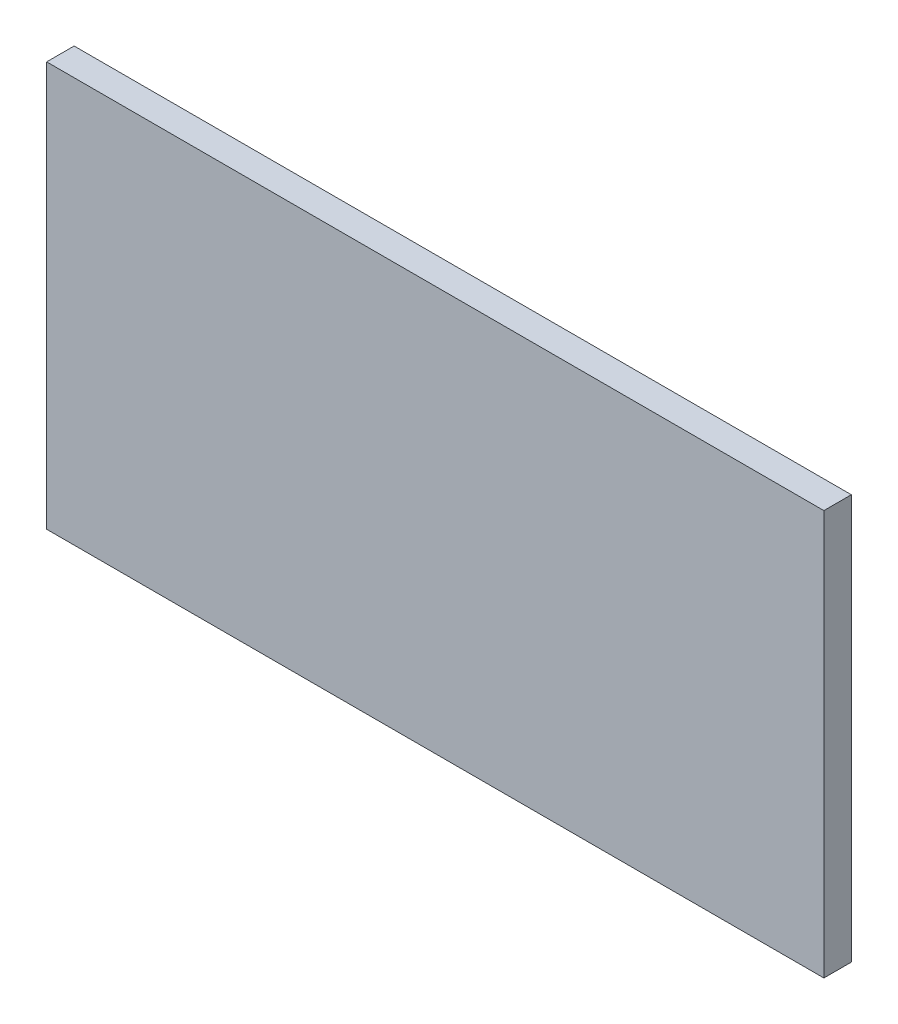
ISO-10303-21;
HEADER;
FILE_DESCRIPTION(('STEP AP214'),'2;1');
FILE_NAME('part.step','',(''),(''),'','','');
FILE_SCHEMA(('AUTOMOTIVE_DESIGN { 1 0 10303 214 1 1 1 1 }'));
ENDSEC;
DATA;
#1=APPLICATION_CONTEXT('core data for automotive mechanical design processes');
#2=APPLICATION_PROTOCOL_DEFINITION('international standard','automotive_design',2000,#1);
#3=PRODUCT_CONTEXT('',#1,'mechanical');
#4=PRODUCT('Part','Part','',(#3));
#5=PRODUCT_RELATED_PRODUCT_CATEGORY('part','',(#4));
#6=PRODUCT_DEFINITION_FORMATION('','',#4);
#7=PRODUCT_DEFINITION_CONTEXT('part definition',#1,'design');
#8=PRODUCT_DEFINITION('design','',#6,#7);
#9=PRODUCT_DEFINITION_SHAPE('','',#8);
#10=(LENGTH_UNIT() NAMED_UNIT(*) SI_UNIT(.MILLI.,.METRE.));
#11=(NAMED_UNIT(*) PLANE_ANGLE_UNIT() SI_UNIT($,.RADIAN.));
#12=(NAMED_UNIT(*) SI_UNIT($,.STERADIAN.) SOLID_ANGLE_UNIT());
#13=UNCERTAINTY_MEASURE_WITH_UNIT(LENGTH_MEASURE(1.E-05),#10,'distance_accuracy_value','');
#14=(GEOMETRIC_REPRESENTATION_CONTEXT(3) GLOBAL_UNCERTAINTY_ASSIGNED_CONTEXT((#13)) GLOBAL_UNIT_ASSIGNED_CONTEXT((#10,
#11,#12)) REPRESENTATION_CONTEXT('',''));
#15=CARTESIAN_POINT('',(0.,0.,0.));
#16=DIRECTION('',(0.,0.,1.));
#17=DIRECTION('',(1.,0.,0.));
#18=AXIS2_PLACEMENT_3D('',#15,#16,#17);
#19=CARTESIAN_POINT('',(0.,0.,1.69651934));
#20=DIRECTION('',(0.,0.,1.));
#21=DIRECTION('',(1.,0.,0.));
#22=AXIS2_PLACEMENT_3D('',#19,#20,#21);
#23=PLANE('',#22);
#24=DIRECTION('',(1.,0.,0.));
#25=VECTOR('',#24,1.);
#26=CARTESIAN_POINT('',(0.,25.0000008,1.69651934));
#27=LINE('',#26,#25);
#28=CARTESIAN_POINT('',(0.,25.0000008,1.69651934));
#29=VERTEX_POINT('',#28);
#30=CARTESIAN_POINT('',(48.00000052,25.0000008,1.69651934));
#31=VERTEX_POINT('',#30);
#32=EDGE_CURVE('E53',#29,#31,#27,.T.);
#33=ORIENTED_EDGE('',*,*,#32,.F.);
#34=DIRECTION('',(0.,1.,0.));
#35=VECTOR('',#34,1.);
#36=CARTESIAN_POINT('',(0.,0.,1.69651934));
#37=LINE('',#36,#35);
#38=CARTESIAN_POINT('',(0.,0.,1.69651934));
#39=VERTEX_POINT('',#38);
#40=EDGE_CURVE('E68',#39,#29,#37,.T.);
#41=ORIENTED_EDGE('',*,*,#40,.F.);
#42=DIRECTION('',(1.,0.,0.));
#43=VECTOR('',#42,1.);
#44=CARTESIAN_POINT('',(48.00000052,0.,1.69651934));
#45=LINE('',#44,#43);
#46=CARTESIAN_POINT('',(48.00000052,0.,1.69651934));
#47=VERTEX_POINT('',#46);
#48=EDGE_CURVE('E20',#47,#39,#45,.F.);
#49=ORIENTED_EDGE('',*,*,#48,.F.);
#50=DIRECTION('',(0.,1.,0.));
#51=VECTOR('',#50,1.);
#52=CARTESIAN_POINT('',(48.00000052,25.0000008,1.69651934));
#53=LINE('',#52,#51);
#54=EDGE_CURVE('E58',#31,#47,#53,.F.);
#55=ORIENTED_EDGE('',*,*,#54,.F.);
#56=EDGE_LOOP('',(#33,#41,#49,#55));
#57=FACE_BOUND('',#56,.T.);
#58=ADVANCED_FACE('F17',(#57),#23,.T.);
#59=CARTESIAN_POINT('',(48.00000052,0.,0.));
#60=DIRECTION('',(0.,-1.,0.));
#61=DIRECTION('',(0.,0.,-1.));
#62=AXIS2_PLACEMENT_3D('',#59,#60,#61);
#63=PLANE('',#62);
#64=DIRECTION('',(0.,0.,1.));
#65=VECTOR('',#64,1.);
#66=CARTESIAN_POINT('',(0.,0.,0.));
#67=LINE('',#66,#65);
#68=CARTESIAN_POINT('',(0.,0.,0.));
#69=VERTEX_POINT('',#68);
#70=EDGE_CURVE('E78',#69,#39,#67,.T.);
#71=ORIENTED_EDGE('',*,*,#70,.F.);
#72=DIRECTION('',(1.,0.,0.));
#73=VECTOR('',#72,1.);
#74=CARTESIAN_POINT('',(0.,0.,0.));
#75=LINE('',#74,#73);
#76=CARTESIAN_POINT('',(48.00000052,0.,0.));
#77=VERTEX_POINT('',#76);
#78=EDGE_CURVE('E74',#69,#77,#75,.T.);
#79=ORIENTED_EDGE('',*,*,#78,.T.);
#80=DIRECTION('',(0.,0.,-1.));
#81=VECTOR('',#80,1.);
#82=CARTESIAN_POINT('',(48.00000052,0.,0.));
#83=LINE('',#82,#81);
#84=EDGE_CURVE('E62',#47,#77,#83,.T.);
#85=ORIENTED_EDGE('',*,*,#84,.F.);
#86=ORIENTED_EDGE('',*,*,#48,.T.);
#87=EDGE_LOOP('',(#71,#79,#85,#86));
#88=FACE_BOUND('',#87,.T.);
#89=ADVANCED_FACE('F73',(#88),#63,.T.);
#90=CARTESIAN_POINT('',(48.00000052,25.0000008,0.));
#91=DIRECTION('',(1.,0.,0.));
#92=DIRECTION('',(0.,0.,-1.));
#93=AXIS2_PLACEMENT_3D('',#90,#91,#92);
#94=PLANE('',#93);
#95=ORIENTED_EDGE('',*,*,#54,.T.);
#96=ORIENTED_EDGE('',*,*,#84,.T.);
#97=DIRECTION('',(0.,1.,0.));
#98=VECTOR('',#97,1.);
#99=CARTESIAN_POINT('',(48.00000052,0.,0.));
#100=LINE('',#99,#98);
#101=CARTESIAN_POINT('',(48.00000052,25.0000008,0.));
#102=VERTEX_POINT('',#101);
#103=EDGE_CURVE('E84',#77,#102,#100,.T.);
#104=ORIENTED_EDGE('',*,*,#103,.T.);
#105=DIRECTION('',(0.,0.,1.));
#106=VECTOR('',#105,1.);
#107=CARTESIAN_POINT('',(48.00000052,25.0000008,0.));
#108=LINE('',#107,#106);
#109=EDGE_CURVE('E64',#31,#102,#108,.F.);
#110=ORIENTED_EDGE('',*,*,#109,.F.);
#111=EDGE_LOOP('',(#95,#96,#104,#110));
#112=FACE_BOUND('',#111,.T.);
#113=ADVANCED_FACE('F60',(#112),#94,.T.);
#114=CARTESIAN_POINT('',(0.,25.0000008,0.));
#115=DIRECTION('',(0.,1.,0.));
#116=DIRECTION('',(0.,0.,1.));
#117=AXIS2_PLACEMENT_3D('',#114,#115,#116);
#118=PLANE('',#117);
#119=ORIENTED_EDGE('',*,*,#32,.T.);
#120=ORIENTED_EDGE('',*,*,#109,.T.);
#121=DIRECTION('',(1.,0.,0.));
#122=VECTOR('',#121,1.);
#123=CARTESIAN_POINT('',(0.,25.0000008,0.));
#124=LINE('',#123,#122);
#125=CARTESIAN_POINT('',(0.,25.0000008,0.));
#126=VERTEX_POINT('',#125);
#127=EDGE_CURVE('E26',#102,#126,#124,.F.);
#128=ORIENTED_EDGE('',*,*,#127,.T.);
#129=DIRECTION('',(0.,0.,1.));
#130=VECTOR('',#129,1.);
#131=CARTESIAN_POINT('',(0.,25.0000008,0.));
#132=LINE('',#131,#130);
#133=EDGE_CURVE('E81',#29,#126,#132,.F.);
#134=ORIENTED_EDGE('',*,*,#133,.F.);
#135=EDGE_LOOP('',(#119,#120,#128,#134));
#136=FACE_BOUND('',#135,.T.);
#137=ADVANCED_FACE('F87',(#136),#118,.T.);
#138=CARTESIAN_POINT('',(0.,0.,0.));
#139=DIRECTION('',(-1.,0.,0.));
#140=DIRECTION('',(0.,0.,1.));
#141=AXIS2_PLACEMENT_3D('',#138,#139,#140);
#142=PLANE('',#141);
#143=ORIENTED_EDGE('',*,*,#133,.T.);
#144=DIRECTION('',(0.,1.,0.));
#145=VECTOR('',#144,1.);
#146=CARTESIAN_POINT('',(0.,0.,0.));
#147=LINE('',#146,#145);
#148=EDGE_CURVE('E11',#126,#69,#147,.F.);
#149=ORIENTED_EDGE('',*,*,#148,.T.);
#150=ORIENTED_EDGE('',*,*,#70,.T.);
#151=ORIENTED_EDGE('',*,*,#40,.T.);
#152=EDGE_LOOP('',(#143,#149,#150,#151));
#153=FACE_BOUND('',#152,.T.);
#154=ADVANCED_FACE('F91',(#153),#142,.T.);
#155=CARTESIAN_POINT('',(0.,0.,0.));
#156=DIRECTION('',(0.,0.,1.));
#157=DIRECTION('',(1.,0.,0.));
#158=AXIS2_PLACEMENT_3D('',#155,#156,#157);
#159=PLANE('',#158);
#160=ORIENTED_EDGE('',*,*,#148,.F.);
#161=ORIENTED_EDGE('',*,*,#127,.F.);
#162=ORIENTED_EDGE('',*,*,#103,.F.);
#163=ORIENTED_EDGE('',*,*,#78,.F.);
#164=EDGE_LOOP('',(#160,#161,#162,#163));
#165=FACE_BOUND('',#164,.T.);
#166=ADVANCED_FACE('F89',(#165),#159,.F.);
#167=CLOSED_SHELL('',(#58,#89,#113,#137,#154,#166));
#168=MANIFOLD_SOLID_BREP('B1',#167);
#169=ADVANCED_BREP_SHAPE_REPRESENTATION('',(#18,#168),#14);
#170=SHAPE_DEFINITION_REPRESENTATION(#9,#169);
ENDSEC;
END-ISO-10303-21;
